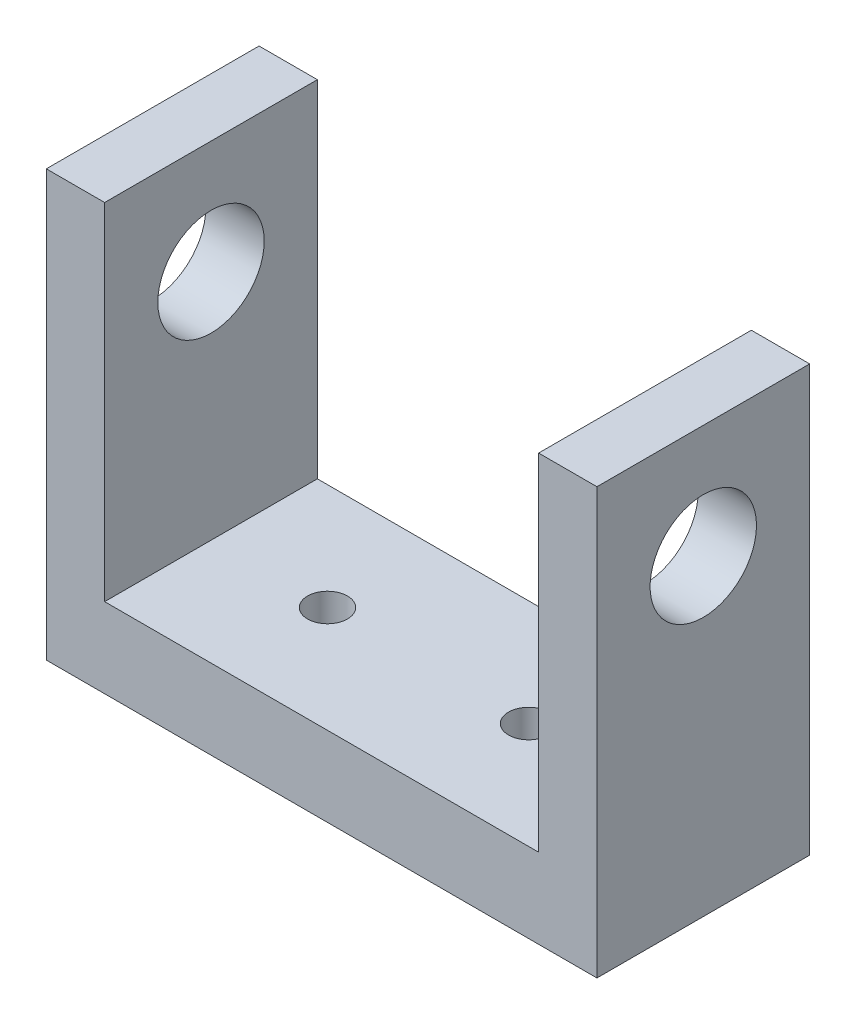
ISO-10303-21;
HEADER;
FILE_DESCRIPTION(('STEP AP214'),'2;1');
FILE_NAME('part.step','',(''),(''),'','','');
FILE_SCHEMA(('AUTOMOTIVE_DESIGN { 1 0 10303 214 1 1 1 1 }'));
ENDSEC;
DATA;
#1=APPLICATION_CONTEXT('core data for automotive mechanical design processes');
#2=APPLICATION_PROTOCOL_DEFINITION('international standard','automotive_design',2000,#1);
#3=PRODUCT_CONTEXT('',#1,'mechanical');
#4=PRODUCT('Part','Part','',(#3));
#5=PRODUCT_RELATED_PRODUCT_CATEGORY('part','',(#4));
#6=PRODUCT_DEFINITION_FORMATION('','',#4);
#7=PRODUCT_DEFINITION_CONTEXT('part definition',#1,'design');
#8=PRODUCT_DEFINITION('design','',#6,#7);
#9=PRODUCT_DEFINITION_SHAPE('','',#8);
#10=(LENGTH_UNIT() NAMED_UNIT(*) SI_UNIT(.MILLI.,.METRE.));
#11=(NAMED_UNIT(*) PLANE_ANGLE_UNIT() SI_UNIT($,.RADIAN.));
#12=(NAMED_UNIT(*) SI_UNIT($,.STERADIAN.) SOLID_ANGLE_UNIT());
#13=UNCERTAINTY_MEASURE_WITH_UNIT(LENGTH_MEASURE(1.E-05),#10,'distance_accuracy_value','');
#14=(GEOMETRIC_REPRESENTATION_CONTEXT(3) GLOBAL_UNCERTAINTY_ASSIGNED_CONTEXT((#13)) GLOBAL_UNIT_ASSIGNED_CONTEXT((#10,
#11,#12)) REPRESENTATION_CONTEXT('',''));
#15=CARTESIAN_POINT('',(0.,0.,0.));
#16=DIRECTION('',(0.,0.,1.));
#17=DIRECTION('',(1.,0.,0.));
#18=AXIS2_PLACEMENT_3D('',#15,#16,#17);
#19=CARTESIAN_POINT('',(8.21764705882353,12.7,-3.175));
#20=DIRECTION('',(0.,-1.,0.));
#21=DIRECTION('',(0.,0.,-1.));
#22=AXIS2_PLACEMENT_3D('',#19,#20,#21);
#23=PLANE('',#22);
#24=DIRECTION('',(1.,0.,0.));
#25=VECTOR('',#24,1.);
#26=CARTESIAN_POINT('',(-8.21764705882353,12.7,3.175));
#27=LINE('',#26,#25);
#28=CARTESIAN_POINT('',(-8.21764705882353,12.7,3.175));
#29=VERTEX_POINT('',#28);
#30=CARTESIAN_POINT('',(-6.477,12.7,3.175));
#31=VERTEX_POINT('',#30);
#32=EDGE_CURVE('E146',#29,#31,#27,.T.);
#33=ORIENTED_EDGE('',*,*,#32,.T.);
#34=DIRECTION('',(0.,0.,1.));
#35=VECTOR('',#34,1.);
#36=CARTESIAN_POINT('',(-6.477,12.7,3.175));
#37=LINE('',#36,#35);
#38=CARTESIAN_POINT('',(-6.477,12.7,-3.175));
#39=VERTEX_POINT('',#38);
#40=EDGE_CURVE('E128',#39,#31,#37,.T.);
#41=ORIENTED_EDGE('',*,*,#40,.F.);
#42=DIRECTION('',(-1.,0.,0.));
#43=VECTOR('',#42,1.);
#44=CARTESIAN_POINT('',(-8.21764705882353,12.7,-3.175));
#45=LINE('',#44,#43);
#46=CARTESIAN_POINT('',(-8.21764705882353,12.7,-3.175));
#47=VERTEX_POINT('',#46);
#48=EDGE_CURVE('E133',#39,#47,#45,.T.);
#49=ORIENTED_EDGE('',*,*,#48,.T.);
#50=DIRECTION('',(0.,0.,1.));
#51=VECTOR('',#50,1.);
#52=CARTESIAN_POINT('',(-8.21764705882353,12.7,3.175));
#53=LINE('',#52,#51);
#54=EDGE_CURVE('E144',#47,#29,#53,.T.);
#55=ORIENTED_EDGE('',*,*,#54,.T.);
#56=EDGE_LOOP('',(#33,#41,#49,#55));
#57=FACE_BOUND('',#56,.T.);
#58=ADVANCED_FACE('F36',(#57),#23,.F.);
#59=CARTESIAN_POINT('',(8.21764705882353,12.7,3.175));
#60=DIRECTION('',(-1.,0.,0.));
#61=DIRECTION('',(0.,0.,1.));
#62=AXIS2_PLACEMENT_3D('',#59,#60,#61);
#63=PLANE('',#62);
#64=CARTESIAN_POINT('',(8.21764705882353,9.3218,0.));
#65=DIRECTION('',(1.,0.,0.));
#66=DIRECTION('',(0.,0.,-1.));
#67=AXIS2_PLACEMENT_3D('',#64,#65,#66);
#68=CIRCLE('',#67,1.5875);
#69=CARTESIAN_POINT('',(8.21764705882353,9.3218,-1.5875));
#70=VERTEX_POINT('',#69);
#71=EDGE_CURVE('E183',#70,#70,#68,.T.);
#72=ORIENTED_EDGE('',*,*,#71,.F.);
#73=EDGE_LOOP('',(#72));
#74=FACE_BOUND('',#73,.T.);
#75=DIRECTION('',(0.,0.,-1.));
#76=VECTOR('',#75,1.);
#77=CARTESIAN_POINT('',(8.21764705882353,0.,3.175));
#78=LINE('',#77,#76);
#79=CARTESIAN_POINT('',(8.21764705882353,0.,3.175));
#80=VERTEX_POINT('',#79);
#81=CARTESIAN_POINT('',(8.21764705882353,0.,-3.175));
#82=VERTEX_POINT('',#81);
#83=EDGE_CURVE('E140',#80,#82,#78,.T.);
#84=ORIENTED_EDGE('',*,*,#83,.T.);
#85=DIRECTION('',(0.,-1.,0.));
#86=VECTOR('',#85,1.);
#87=CARTESIAN_POINT('',(8.21764705882353,12.7,-3.175));
#88=LINE('',#87,#86);
#89=CARTESIAN_POINT('',(8.21764705882353,12.7,-3.175));
#90=VERTEX_POINT('',#89);
#91=EDGE_CURVE('E12',#90,#82,#88,.T.);
#92=ORIENTED_EDGE('',*,*,#91,.F.);
#93=DIRECTION('',(0.,0.,-1.));
#94=VECTOR('',#93,1.);
#95=CARTESIAN_POINT('',(8.21764705882353,12.7,3.175));
#96=LINE('',#95,#94);
#97=CARTESIAN_POINT('',(8.21764705882353,12.7,3.175));
#98=VERTEX_POINT('',#97);
#99=EDGE_CURVE('E141',#98,#90,#96,.T.);
#100=ORIENTED_EDGE('',*,*,#99,.F.);
#101=DIRECTION('',(0.,-1.,0.));
#102=VECTOR('',#101,1.);
#103=CARTESIAN_POINT('',(8.21764705882353,12.7,3.175));
#104=LINE('',#103,#102);
#105=EDGE_CURVE('E149',#98,#80,#104,.T.);
#106=ORIENTED_EDGE('',*,*,#105,.T.);
#107=EDGE_LOOP('',(#84,#92,#100,#106));
#108=FACE_BOUND('',#107,.T.);
#109=ADVANCED_FACE('F38',(#74,#108),#63,.F.);
#110=CARTESIAN_POINT('',(-8.21764705882353,12.7,-3.175));
#111=DIRECTION('',(0.,0.,1.));
#112=DIRECTION('',(1.,0.,0.));
#113=AXIS2_PLACEMENT_3D('',#110,#111,#112);
#114=PLANE('',#113);
#115=ORIENTED_EDGE('',*,*,#48,.F.);
#116=DIRECTION('',(0.,1.,0.));
#117=VECTOR('',#116,1.);
#118=CARTESIAN_POINT('',(-6.477,-14.4266633703015,-3.175));
#119=LINE('',#118,#117);
#120=CARTESIAN_POINT('',(-6.477,2.38125,-3.175));
#121=VERTEX_POINT('',#120);
#122=EDGE_CURVE('E115',#121,#39,#119,.T.);
#123=ORIENTED_EDGE('',*,*,#122,.F.);
#124=DIRECTION('',(-1.,0.,0.));
#125=VECTOR('',#124,1.);
#126=CARTESIAN_POINT('',(-6.477,2.38125,-3.175));
#127=LINE('',#126,#125);
#128=CARTESIAN_POINT('',(6.477,2.38125,-3.175));
#129=VERTEX_POINT('',#128);
#130=EDGE_CURVE('E124',#129,#121,#127,.T.);
#131=ORIENTED_EDGE('',*,*,#130,.F.);
#132=DIRECTION('',(0.,1.,0.));
#133=VECTOR('',#132,1.);
#134=CARTESIAN_POINT('',(6.477,-14.4266633703015,-3.175));
#135=LINE('',#134,#133);
#136=CARTESIAN_POINT('',(6.477,12.7,-3.175));
#137=VERTEX_POINT('',#136);
#138=EDGE_CURVE('E138',#129,#137,#135,.T.);
#139=ORIENTED_EDGE('',*,*,#138,.T.);
#140=EDGE_CURVE('E89',#90,#137,#45,.T.);
#141=ORIENTED_EDGE('',*,*,#140,.F.);
#142=ORIENTED_EDGE('',*,*,#91,.T.);
#143=DIRECTION('',(-1.,0.,0.));
#144=VECTOR('',#143,1.);
#145=CARTESIAN_POINT('',(-8.21764705882353,0.,-3.175));
#146=LINE('',#145,#144);
#147=CARTESIAN_POINT('',(-8.21764705882353,0.,-3.175));
#148=VERTEX_POINT('',#147);
#149=EDGE_CURVE('E152',#82,#148,#146,.T.);
#150=ORIENTED_EDGE('',*,*,#149,.T.);
#151=DIRECTION('',(0.,-1.,0.));
#152=VECTOR('',#151,1.);
#153=CARTESIAN_POINT('',(-8.21764705882353,12.7,-3.175));
#154=LINE('',#153,#152);
#155=EDGE_CURVE('E45',#47,#148,#154,.T.);
#156=ORIENTED_EDGE('',*,*,#155,.F.);
#157=EDGE_LOOP('',(#115,#123,#131,#139,#141,#142,#150,#156));
#158=FACE_BOUND('',#157,.T.);
#159=ADVANCED_FACE('F131',(#158),#114,.F.);
#160=CARTESIAN_POINT('',(-8.21764705882353,12.7,3.175));
#161=DIRECTION('',(1.,0.,0.));
#162=DIRECTION('',(0.,0.,-1.));
#163=AXIS2_PLACEMENT_3D('',#160,#161,#162);
#164=PLANE('',#163);
#165=CARTESIAN_POINT('',(-8.21764705882353,9.3218,0.));
#166=DIRECTION('',(1.,0.,0.));
#167=DIRECTION('',(0.,0.,-1.));
#168=AXIS2_PLACEMENT_3D('',#165,#166,#167);
#169=CIRCLE('',#168,1.5875);
#170=CARTESIAN_POINT('',(-8.21764705882353,9.3218,-1.5875));
#171=VERTEX_POINT('',#170);
#172=EDGE_CURVE('E186',#171,#171,#169,.T.);
#173=ORIENTED_EDGE('',*,*,#172,.T.);
#174=EDGE_LOOP('',(#173));
#175=FACE_BOUND('',#174,.T.);
#176=DIRECTION('',(0.,0.,1.));
#177=VECTOR('',#176,1.);
#178=CARTESIAN_POINT('',(-8.21764705882353,0.,3.175));
#179=LINE('',#178,#177);
#180=CARTESIAN_POINT('',(-8.21764705882353,0.,3.175));
#181=VERTEX_POINT('',#180);
#182=EDGE_CURVE('E154',#148,#181,#179,.T.);
#183=ORIENTED_EDGE('',*,*,#182,.T.);
#184=DIRECTION('',(0.,-1.,0.));
#185=VECTOR('',#184,1.);
#186=CARTESIAN_POINT('',(-8.21764705882353,12.7,3.175));
#187=LINE('',#186,#185);
#188=EDGE_CURVE('E158',#29,#181,#187,.T.);
#189=ORIENTED_EDGE('',*,*,#188,.F.);
#190=ORIENTED_EDGE('',*,*,#54,.F.);
#191=ORIENTED_EDGE('',*,*,#155,.T.);
#192=EDGE_LOOP('',(#183,#189,#190,#191));
#193=FACE_BOUND('',#192,.T.);
#194=ADVANCED_FACE('F164',(#175,#193),#164,.F.);
#195=CARTESIAN_POINT('',(-8.21764705882353,12.7,3.175));
#196=DIRECTION('',(0.,0.,-1.));
#197=DIRECTION('',(-1.,0.,0.));
#198=AXIS2_PLACEMENT_3D('',#195,#196,#197);
#199=PLANE('',#198);
#200=DIRECTION('',(1.,0.,0.));
#201=VECTOR('',#200,1.);
#202=CARTESIAN_POINT('',(-6.477,2.38125,3.175));
#203=LINE('',#202,#201);
#204=CARTESIAN_POINT('',(-6.477,2.38125,3.175));
#205=VERTEX_POINT('',#204);
#206=CARTESIAN_POINT('',(6.477,2.38125,3.175));
#207=VERTEX_POINT('',#206);
#208=EDGE_CURVE('E173',#205,#207,#203,.T.);
#209=ORIENTED_EDGE('',*,*,#208,.F.);
#210=DIRECTION('',(0.,1.,0.));
#211=VECTOR('',#210,1.);
#212=CARTESIAN_POINT('',(-6.477,-14.4266633703015,3.175));
#213=LINE('',#212,#211);
#214=EDGE_CURVE('E118',#205,#31,#213,.T.);
#215=ORIENTED_EDGE('',*,*,#214,.T.);
#216=ORIENTED_EDGE('',*,*,#32,.F.);
#217=ORIENTED_EDGE('',*,*,#188,.T.);
#218=DIRECTION('',(1.,0.,0.));
#219=VECTOR('',#218,1.);
#220=CARTESIAN_POINT('',(-8.21764705882353,0.,3.175));
#221=LINE('',#220,#219);
#222=EDGE_CURVE('E82',#181,#80,#221,.T.);
#223=ORIENTED_EDGE('',*,*,#222,.T.);
#224=ORIENTED_EDGE('',*,*,#105,.F.);
#225=CARTESIAN_POINT('',(6.477,12.7,3.175));
#226=VERTEX_POINT('',#225);
#227=EDGE_CURVE('E60',#226,#98,#27,.T.);
#228=ORIENTED_EDGE('',*,*,#227,.F.);
#229=DIRECTION('',(0.,1.,0.));
#230=VECTOR('',#229,1.);
#231=CARTESIAN_POINT('',(6.477,-14.4266633703015,3.175));
#232=LINE('',#231,#230);
#233=EDGE_CURVE('E52',#207,#226,#232,.T.);
#234=ORIENTED_EDGE('',*,*,#233,.F.);
#235=EDGE_LOOP('',(#209,#215,#216,#217,#223,#224,#228,#234));
#236=FACE_BOUND('',#235,.T.);
#237=ADVANCED_FACE('F172',(#236),#199,.F.);
#238=ORIENTED_EDGE('',*,*,#140,.T.);
#239=DIRECTION('',(0.,0.,-1.));
#240=VECTOR('',#239,1.);
#241=CARTESIAN_POINT('',(6.477,12.7,3.175));
#242=LINE('',#241,#240);
#243=EDGE_CURVE('E177',#226,#137,#242,.T.);
#244=ORIENTED_EDGE('',*,*,#243,.F.);
#245=ORIENTED_EDGE('',*,*,#227,.T.);
#246=ORIENTED_EDGE('',*,*,#99,.T.);
#247=EDGE_LOOP('',(#238,#244,#245,#246));
#248=FACE_BOUND('',#247,.T.);
#249=ADVANCED_FACE('F227',(#248),#23,.F.);
#250=CARTESIAN_POINT('',(8.21764705882353,0.,-3.175));
#251=DIRECTION('',(0.,-1.,0.));
#252=DIRECTION('',(0.,0.,-1.));
#253=AXIS2_PLACEMENT_3D('',#250,#251,#252);
#254=PLANE('',#253);
#255=CARTESIAN_POINT('',(-3.,0.,0.));
#256=DIRECTION('',(0.,1.,0.));
#257=DIRECTION('',(0.,0.,1.));
#258=AXIS2_PLACEMENT_3D('',#255,#256,#257);
#259=CIRCLE('',#258,0.595629999999999);
#260=CARTESIAN_POINT('',(-3.,0.,0.595629999999999));
#261=VERTEX_POINT('',#260);
#262=EDGE_CURVE('E195',#261,#261,#259,.T.);
#263=ORIENTED_EDGE('',*,*,#262,.T.);
#264=EDGE_LOOP('',(#263));
#265=FACE_BOUND('',#264,.T.);
#266=CARTESIAN_POINT('',(3.,0.,0.));
#267=DIRECTION('',(0.,1.,0.));
#268=DIRECTION('',(0.,0.,1.));
#269=AXIS2_PLACEMENT_3D('',#266,#267,#268);
#270=CIRCLE('',#269,0.595629999999999);
#271=CARTESIAN_POINT('',(3.,0.,0.595629999999999));
#272=VERTEX_POINT('',#271);
#273=EDGE_CURVE('E187',#272,#272,#270,.T.);
#274=ORIENTED_EDGE('',*,*,#273,.T.);
#275=EDGE_LOOP('',(#274));
#276=FACE_BOUND('',#275,.T.);
#277=ORIENTED_EDGE('',*,*,#83,.F.);
#278=ORIENTED_EDGE('',*,*,#222,.F.);
#279=ORIENTED_EDGE('',*,*,#182,.F.);
#280=ORIENTED_EDGE('',*,*,#149,.F.);
#281=EDGE_LOOP('',(#277,#278,#279,#280));
#282=FACE_BOUND('',#281,.T.);
#283=ADVANCED_FACE('F168',(#265,#276,#282),#254,.T.);
#284=CARTESIAN_POINT('',(8.21764705882353,2.38125,-3.175));
#285=DIRECTION('',(0.,-1.,0.));
#286=DIRECTION('',(0.,0.,-1.));
#287=AXIS2_PLACEMENT_3D('',#284,#285,#286);
#288=PLANE('',#287);
#289=CARTESIAN_POINT('',(-3.,2.38125,0.));
#290=DIRECTION('',(0.,1.,0.));
#291=DIRECTION('',(0.,0.,1.));
#292=AXIS2_PLACEMENT_3D('',#289,#290,#291);
#293=CIRCLE('',#292,0.595629999999988);
#294=CARTESIAN_POINT('',(-3.,2.38125,0.595629999999988));
#295=VERTEX_POINT('',#294);
#296=EDGE_CURVE('E198',#295,#295,#293,.T.);
#297=ORIENTED_EDGE('',*,*,#296,.F.);
#298=EDGE_LOOP('',(#297));
#299=FACE_BOUND('',#298,.T.);
#300=CARTESIAN_POINT('',(3.,2.38125,0.));
#301=DIRECTION('',(0.,1.,0.));
#302=DIRECTION('',(0.,0.,1.));
#303=AXIS2_PLACEMENT_3D('',#300,#301,#302);
#304=CIRCLE('',#303,0.595629999999988);
#305=CARTESIAN_POINT('',(3.,2.38125,0.595629999999988));
#306=VERTEX_POINT('',#305);
#307=EDGE_CURVE('E192',#306,#306,#304,.T.);
#308=ORIENTED_EDGE('',*,*,#307,.F.);
#309=EDGE_LOOP('',(#308));
#310=FACE_BOUND('',#309,.T.);
#311=DIRECTION('',(0.,0.,-1.));
#312=VECTOR('',#311,1.);
#313=CARTESIAN_POINT('',(6.477,2.38125,3.175));
#314=LINE('',#313,#312);
#315=EDGE_CURVE('E126',#207,#129,#314,.T.);
#316=ORIENTED_EDGE('',*,*,#315,.T.);
#317=ORIENTED_EDGE('',*,*,#130,.T.);
#318=DIRECTION('',(0.,0.,1.));
#319=VECTOR('',#318,1.);
#320=CARTESIAN_POINT('',(-6.477,2.38125,3.175));
#321=LINE('',#320,#319);
#322=EDGE_CURVE('E111',#121,#205,#321,.T.);
#323=ORIENTED_EDGE('',*,*,#322,.T.);
#324=ORIENTED_EDGE('',*,*,#208,.T.);
#325=EDGE_LOOP('',(#316,#317,#323,#324));
#326=FACE_BOUND('',#325,.T.);
#327=ADVANCED_FACE('F125',(#299,#310,#326),#288,.F.);
#328=CARTESIAN_POINT('',(-6.477,-14.4266633703015,3.175));
#329=DIRECTION('',(-1.,0.,0.));
#330=DIRECTION('',(0.,0.,1.));
#331=AXIS2_PLACEMENT_3D('',#328,#329,#330);
#332=PLANE('',#331);
#333=CARTESIAN_POINT('',(-6.477,9.3218,0.));
#334=DIRECTION('',(-1.,0.,0.));
#335=DIRECTION('',(0.,0.,1.));
#336=AXIS2_PLACEMENT_3D('',#333,#334,#335);
#337=CIRCLE('',#336,1.5875);
#338=CARTESIAN_POINT('',(-6.477,9.3218,1.5875));
#339=VERTEX_POINT('',#338);
#340=EDGE_CURVE('E179',#339,#339,#337,.T.);
#341=ORIENTED_EDGE('',*,*,#340,.T.);
#342=EDGE_LOOP('',(#341));
#343=FACE_BOUND('',#342,.T.);
#344=ORIENTED_EDGE('',*,*,#122,.T.);
#345=ORIENTED_EDGE('',*,*,#40,.T.);
#346=ORIENTED_EDGE('',*,*,#214,.F.);
#347=ORIENTED_EDGE('',*,*,#322,.F.);
#348=EDGE_LOOP('',(#344,#345,#346,#347));
#349=FACE_BOUND('',#348,.T.);
#350=ADVANCED_FACE('F113',(#343,#349),#332,.F.);
#351=CARTESIAN_POINT('',(6.477,-14.4266633703015,3.175));
#352=DIRECTION('',(1.,0.,0.));
#353=DIRECTION('',(0.,0.,-1.));
#354=AXIS2_PLACEMENT_3D('',#351,#352,#353);
#355=PLANE('',#354);
#356=CARTESIAN_POINT('',(6.477,9.3218,0.));
#357=DIRECTION('',(1.,0.,0.));
#358=DIRECTION('',(0.,0.,-1.));
#359=AXIS2_PLACEMENT_3D('',#356,#357,#358);
#360=CIRCLE('',#359,1.5875);
#361=CARTESIAN_POINT('',(6.477,9.3218,-1.5875));
#362=VERTEX_POINT('',#361);
#363=EDGE_CURVE('E40',#362,#362,#360,.T.);
#364=ORIENTED_EDGE('',*,*,#363,.T.);
#365=EDGE_LOOP('',(#364));
#366=FACE_BOUND('',#365,.T.);
#367=ORIENTED_EDGE('',*,*,#233,.T.);
#368=ORIENTED_EDGE('',*,*,#243,.T.);
#369=ORIENTED_EDGE('',*,*,#138,.F.);
#370=ORIENTED_EDGE('',*,*,#315,.F.);
#371=EDGE_LOOP('',(#367,#368,#369,#370));
#372=FACE_BOUND('',#371,.T.);
#373=ADVANCED_FACE('F240',(#366,#372),#355,.F.);
#374=CARTESIAN_POINT('',(-8.21764705882353,9.3218,0.));
#375=DIRECTION('',(1.,0.,0.));
#376=DIRECTION('',(0.,0.,-1.));
#377=AXIS2_PLACEMENT_3D('',#374,#375,#376);
#378=CYLINDRICAL_SURFACE('',#377,1.5875);
#379=ORIENTED_EDGE('',*,*,#71,.T.);
#380=EDGE_LOOP('',(#379));
#381=FACE_BOUND('',#380,.T.);
#382=ORIENTED_EDGE('',*,*,#363,.F.);
#383=EDGE_LOOP('',(#382));
#384=FACE_BOUND('',#383,.T.);
#385=ADVANCED_FACE('F220',(#381,#384),#378,.F.);
#386=ORIENTED_EDGE('',*,*,#172,.F.);
#387=EDGE_LOOP('',(#386));
#388=FACE_BOUND('',#387,.T.);
#389=ORIENTED_EDGE('',*,*,#340,.F.);
#390=EDGE_LOOP('',(#389));
#391=FACE_BOUND('',#390,.T.);
#392=ADVANCED_FACE('F211',(#388,#391),#378,.F.);
#393=CARTESIAN_POINT('',(3.,2.38125,0.));
#394=DIRECTION('',(0.,1.,0.));
#395=DIRECTION('',(0.,0.,1.));
#396=AXIS2_PLACEMENT_3D('',#393,#394,#395);
#397=CYLINDRICAL_SURFACE('',#396,0.595629999999993);
#398=ORIENTED_EDGE('',*,*,#273,.F.);
#399=EDGE_LOOP('',(#398));
#400=FACE_BOUND('',#399,.T.);
#401=ORIENTED_EDGE('',*,*,#307,.T.);
#402=EDGE_LOOP('',(#401));
#403=FACE_BOUND('',#402,.T.);
#404=ADVANCED_FACE('F209',(#400,#403),#397,.F.);
#405=CARTESIAN_POINT('',(-3.,2.38125,0.));
#406=DIRECTION('',(0.,1.,0.));
#407=DIRECTION('',(0.,0.,1.));
#408=AXIS2_PLACEMENT_3D('',#405,#406,#407);
#409=CYLINDRICAL_SURFACE('',#408,0.595629999999993);
#410=ORIENTED_EDGE('',*,*,#262,.F.);
#411=EDGE_LOOP('',(#410));
#412=FACE_BOUND('',#411,.T.);
#413=ORIENTED_EDGE('',*,*,#296,.T.);
#414=EDGE_LOOP('',(#413));
#415=FACE_BOUND('',#414,.T.);
#416=ADVANCED_FACE('F202',(#412,#415),#409,.F.);
#417=CLOSED_SHELL('',(#58,#109,#159,#194,#237,#249,#283,#327,#350,#373,#385,#392,#404,#416));
#418=MANIFOLD_SOLID_BREP('B2',#417);
#419=ADVANCED_BREP_SHAPE_REPRESENTATION('',(#18,#418),#14);
#420=SHAPE_DEFINITION_REPRESENTATION(#9,#419);
ENDSEC;
END-ISO-10303-21;
